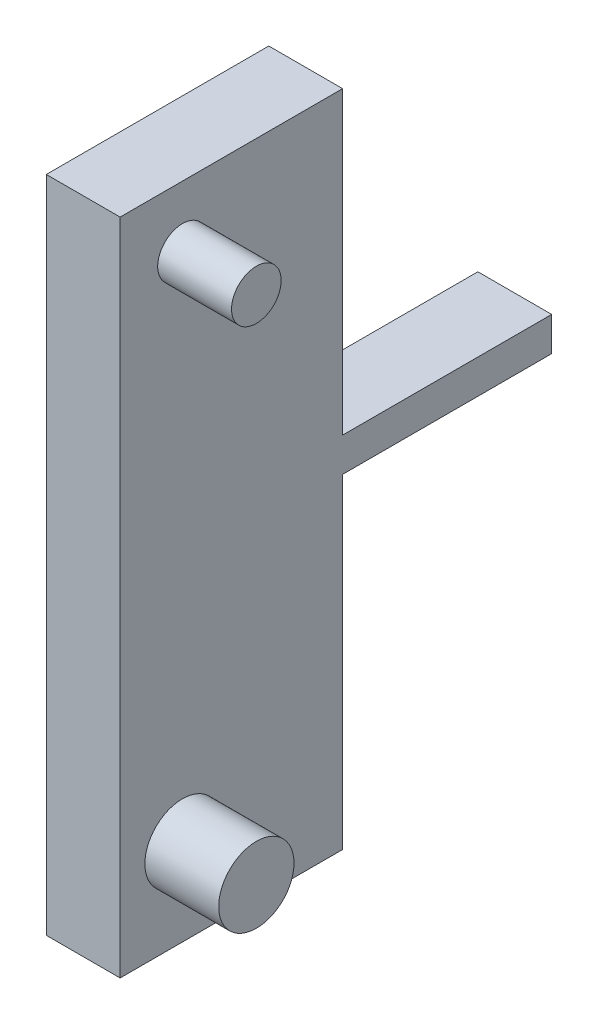
ISO-10303-21;
HEADER;
FILE_DESCRIPTION(('STEP AP214'),'2;1');
FILE_NAME('part.step','',(''),(''),'','','');
FILE_SCHEMA(('AUTOMOTIVE_DESIGN { 1 0 10303 214 1 1 1 1 }'));
ENDSEC;
DATA;
#1=APPLICATION_CONTEXT('core data for automotive mechanical design processes');
#2=APPLICATION_PROTOCOL_DEFINITION('international standard','automotive_design',2000,#1);
#3=PRODUCT_CONTEXT('',#1,'mechanical');
#4=PRODUCT('Part','Part','',(#3));
#5=PRODUCT_RELATED_PRODUCT_CATEGORY('part','',(#4));
#6=PRODUCT_DEFINITION_FORMATION('','',#4);
#7=PRODUCT_DEFINITION_CONTEXT('part definition',#1,'design');
#8=PRODUCT_DEFINITION('design','',#6,#7);
#9=PRODUCT_DEFINITION_SHAPE('','',#8);
#10=(LENGTH_UNIT() NAMED_UNIT(*) SI_UNIT(.MILLI.,.METRE.));
#11=(NAMED_UNIT(*) PLANE_ANGLE_UNIT() SI_UNIT($,.RADIAN.));
#12=(NAMED_UNIT(*) SI_UNIT($,.STERADIAN.) SOLID_ANGLE_UNIT());
#13=UNCERTAINTY_MEASURE_WITH_UNIT(LENGTH_MEASURE(1.E-05),#10,'distance_accuracy_value','');
#14=(GEOMETRIC_REPRESENTATION_CONTEXT(3) GLOBAL_UNCERTAINTY_ASSIGNED_CONTEXT((#13)) GLOBAL_UNIT_ASSIGNED_CONTEXT((#10,
#11,#12)) REPRESENTATION_CONTEXT('',''));
#15=CARTESIAN_POINT('',(0.,0.,0.));
#16=DIRECTION('',(0.,0.,1.));
#17=DIRECTION('',(1.,0.,0.));
#18=AXIS2_PLACEMENT_3D('',#15,#16,#17);
#19=CARTESIAN_POINT('',(10.,-40.9543032918619,44.2382323851614));
#20=DIRECTION('',(-1.,0.,0.));
#21=DIRECTION('',(0.,0.,1.));
#22=AXIS2_PLACEMENT_3D('',#19,#20,#21);
#23=CYLINDRICAL_SURFACE('',#22,1.68);
#24=CARTESIAN_POINT('',(5.,-40.9543032918619,44.2382323851614));
#25=DIRECTION('',(1.,0.,0.));
#26=DIRECTION('',(0.,0.,-1.));
#27=AXIS2_PLACEMENT_3D('',#24,#25,#26);
#28=CIRCLE('',#27,1.68);
#29=CARTESIAN_POINT('',(5.,-40.9543032918619,42.5582323851614));
#30=VERTEX_POINT('',#29);
#31=EDGE_CURVE('E48',#30,#30,#28,.T.);
#32=ORIENTED_EDGE('',*,*,#31,.T.);
#33=EDGE_LOOP('',(#32));
#34=FACE_BOUND('',#33,.T.);
#35=CARTESIAN_POINT('',(10.,-40.9543032918619,44.2382323851614));
#36=DIRECTION('',(1.,0.,0.));
#37=DIRECTION('',(0.,0.,-1.));
#38=AXIS2_PLACEMENT_3D('',#35,#36,#37);
#39=CIRCLE('',#38,1.68);
#40=CARTESIAN_POINT('',(10.,-40.9543032918619,42.5582323851614));
#41=VERTEX_POINT('',#40);
#42=EDGE_CURVE('E11',#41,#41,#39,.T.);
#43=ORIENTED_EDGE('',*,*,#42,.F.);
#44=EDGE_LOOP('',(#43));
#45=FACE_BOUND('',#44,.T.);
#46=ADVANCED_FACE('F44',(#34,#45),#23,.T.);
#47=CARTESIAN_POINT('',(10.,-40.9543032918619,44.2382323851614));
#48=DIRECTION('',(1.,0.,0.));
#49=DIRECTION('',(0.,0.,-1.));
#50=AXIS2_PLACEMENT_3D('',#47,#48,#49);
#51=PLANE('',#50);
#52=ORIENTED_EDGE('',*,*,#42,.T.);
#53=EDGE_LOOP('',(#52));
#54=FACE_BOUND('',#53,.T.);
#55=ADVANCED_FACE('F215',(#54),#51,.T.);
#56=CARTESIAN_POINT('',(5.,-57.1024019508511,0.));
#57=DIRECTION('',(0.,1.,0.));
#58=DIRECTION('',(0.,0.,1.));
#59=AXIS2_PLACEMENT_3D('',#56,#57,#58);
#60=PLANE('',#59);
#61=DIRECTION('',(0.,0.,-1.));
#62=VECTOR('',#61,1.);
#63=CARTESIAN_POINT('',(0.,-57.1024019508511,0.));
#64=LINE('',#63,#62);
#65=CARTESIAN_POINT('',(0.,-57.1024019508511,33.3968296630289));
#66=VERTEX_POINT('',#65);
#67=CARTESIAN_POINT('',(0.,-57.1024019508511,19.2382323851614));
#68=VERTEX_POINT('',#67);
#69=EDGE_CURVE('E149',#66,#68,#64,.T.);
#70=ORIENTED_EDGE('',*,*,#69,.F.);
#71=DIRECTION('',(-1.,0.,0.));
#72=VECTOR('',#71,1.);
#73=CARTESIAN_POINT('',(5.,-57.1024019508511,33.3968296630289));
#74=LINE('',#73,#72);
#75=CARTESIAN_POINT('',(5.,-57.1024019508511,33.3968296630289));
#76=VERTEX_POINT('',#75);
#77=EDGE_CURVE('E104',#76,#66,#74,.T.);
#78=ORIENTED_EDGE('',*,*,#77,.F.);
#79=DIRECTION('',(0.,0.,-1.));
#80=VECTOR('',#79,1.);
#81=CARTESIAN_POINT('',(5.,-57.1024019508511,0.));
#82=LINE('',#81,#80);
#83=CARTESIAN_POINT('',(5.,-57.1024019508511,19.2382323851614));
#84=VERTEX_POINT('',#83);
#85=EDGE_CURVE('E171',#76,#84,#82,.T.);
#86=ORIENTED_EDGE('',*,*,#85,.T.);
#87=DIRECTION('',(-1.,0.,0.));
#88=VECTOR('',#87,1.);
#89=CARTESIAN_POINT('',(5.,-57.1024019508511,19.2382323851614));
#90=LINE('',#89,#88);
#91=EDGE_CURVE('E97',#84,#68,#90,.T.);
#92=ORIENTED_EDGE('',*,*,#91,.T.);
#93=EDGE_LOOP('',(#70,#78,#86,#92));
#94=FACE_BOUND('',#93,.T.);
#95=ADVANCED_FACE('F219',(#94),#60,.T.);
#96=CARTESIAN_POINT('',(5.,0.,33.3968296630289));
#97=DIRECTION('',(0.,0.,1.));
#98=DIRECTION('',(1.,0.,0.));
#99=AXIS2_PLACEMENT_3D('',#96,#97,#98);
#100=PLANE('',#99);
#101=DIRECTION('',(0.,1.,0.));
#102=VECTOR('',#101,1.);
#103=CARTESIAN_POINT('',(0.,0.,33.3968296630289));
#104=LINE('',#103,#102);
#105=CARTESIAN_POINT('',(0.,-36.7831730724219,33.3968296630289));
#106=VERTEX_POINT('',#105);
#107=EDGE_CURVE('E155',#66,#106,#104,.T.);
#108=ORIENTED_EDGE('',*,*,#107,.T.);
#109=DIRECTION('',(-1.,0.,0.));
#110=VECTOR('',#109,1.);
#111=CARTESIAN_POINT('',(5.,-36.7831730724219,33.3968296630289));
#112=LINE('',#111,#110);
#113=CARTESIAN_POINT('',(5.,-36.7831730724219,33.3968296630289));
#114=VERTEX_POINT('',#113);
#115=EDGE_CURVE('E186',#114,#106,#112,.T.);
#116=ORIENTED_EDGE('',*,*,#115,.F.);
#117=DIRECTION('',(0.,1.,0.));
#118=VECTOR('',#117,1.);
#119=CARTESIAN_POINT('',(5.,0.,33.3968296630289));
#120=LINE('',#119,#118);
#121=EDGE_CURVE('E131',#76,#114,#120,.T.);
#122=ORIENTED_EDGE('',*,*,#121,.F.);
#123=ORIENTED_EDGE('',*,*,#77,.T.);
#124=EDGE_LOOP('',(#108,#116,#122,#123));
#125=FACE_BOUND('',#124,.T.);
#126=ADVANCED_FACE('F222',(#125),#100,.F.);
#127=CARTESIAN_POINT('',(5.,-36.7831730724219,0.));
#128=DIRECTION('',(0.,1.,0.));
#129=DIRECTION('',(0.,0.,1.));
#130=AXIS2_PLACEMENT_3D('',#127,#128,#129);
#131=PLANE('',#130);
#132=DIRECTION('',(0.,0.,-1.));
#133=VECTOR('',#132,1.);
#134=CARTESIAN_POINT('',(0.,-36.7831730724219,0.));
#135=LINE('',#134,#133);
#136=CARTESIAN_POINT('',(0.,-36.7831730724219,48.461100861198));
#137=VERTEX_POINT('',#136);
#138=EDGE_CURVE('E160',#137,#106,#135,.T.);
#139=ORIENTED_EDGE('',*,*,#138,.F.);
#140=DIRECTION('',(-1.,0.,0.));
#141=VECTOR('',#140,1.);
#142=CARTESIAN_POINT('',(5.,-36.7831730724219,48.461100861198));
#143=LINE('',#142,#141);
#144=CARTESIAN_POINT('',(5.,-36.7831730724219,48.461100861198));
#145=VERTEX_POINT('',#144);
#146=EDGE_CURVE('E183',#145,#137,#143,.T.);
#147=ORIENTED_EDGE('',*,*,#146,.F.);
#148=DIRECTION('',(0.,0.,-1.));
#149=VECTOR('',#148,1.);
#150=CARTESIAN_POINT('',(5.,-36.7831730724219,0.));
#151=LINE('',#150,#149);
#152=EDGE_CURVE('E333',#145,#114,#151,.T.);
#153=ORIENTED_EDGE('',*,*,#152,.T.);
#154=ORIENTED_EDGE('',*,*,#115,.T.);
#155=EDGE_LOOP('',(#139,#147,#153,#154));
#156=FACE_BOUND('',#155,.T.);
#157=ADVANCED_FACE('F230',(#156),#131,.T.);
#158=CARTESIAN_POINT('',(5.,0.,48.461100861198));
#159=DIRECTION('',(0.,0.,1.));
#160=DIRECTION('',(1.,0.,0.));
#161=AXIS2_PLACEMENT_3D('',#158,#159,#160);
#162=PLANE('',#161);
#163=DIRECTION('',(0.,1.,0.));
#164=VECTOR('',#163,1.);
#165=CARTESIAN_POINT('',(0.,0.,48.461100861198));
#166=LINE('',#165,#164);
#167=CARTESIAN_POINT('',(0.,-81.4075236028473,48.461100861198));
#168=VERTEX_POINT('',#167);
#169=EDGE_CURVE('E163',#168,#137,#166,.T.);
#170=ORIENTED_EDGE('',*,*,#169,.F.);
#171=DIRECTION('',(-1.,0.,0.));
#172=VECTOR('',#171,1.);
#173=CARTESIAN_POINT('',(5.,-81.4075236028473,48.461100861198));
#174=LINE('',#173,#172);
#175=CARTESIAN_POINT('',(5.,-81.4075236028473,48.461100861198));
#176=VERTEX_POINT('',#175);
#177=EDGE_CURVE('E179',#176,#168,#174,.T.);
#178=ORIENTED_EDGE('',*,*,#177,.F.);
#179=DIRECTION('',(0.,1.,0.));
#180=VECTOR('',#179,1.);
#181=CARTESIAN_POINT('',(5.,0.,48.461100861198));
#182=LINE('',#181,#180);
#183=EDGE_CURVE('E332',#176,#145,#182,.T.);
#184=ORIENTED_EDGE('',*,*,#183,.T.);
#185=ORIENTED_EDGE('',*,*,#146,.T.);
#186=EDGE_LOOP('',(#170,#178,#184,#185));
#187=FACE_BOUND('',#186,.T.);
#188=ADVANCED_FACE('F229',(#187),#162,.T.);
#189=CARTESIAN_POINT('',(5.,-81.4075236028473,0.));
#190=DIRECTION('',(0.,1.,0.));
#191=DIRECTION('',(0.,0.,1.));
#192=AXIS2_PLACEMENT_3D('',#189,#190,#191);
#193=PLANE('',#192);
#194=DIRECTION('',(0.,0.,-1.));
#195=VECTOR('',#194,1.);
#196=CARTESIAN_POINT('',(0.,-81.4075236028473,0.));
#197=LINE('',#196,#195);
#198=CARTESIAN_POINT('',(0.,-81.4075236028473,33.3968296630289));
#199=VERTEX_POINT('',#198);
#200=EDGE_CURVE('E164',#168,#199,#197,.T.);
#201=ORIENTED_EDGE('',*,*,#200,.T.);
#202=DIRECTION('',(-1.,0.,0.));
#203=VECTOR('',#202,1.);
#204=CARTESIAN_POINT('',(5.,-81.4075236028473,33.3968296630289));
#205=LINE('',#204,#203);
#206=CARTESIAN_POINT('',(5.,-81.4075236028473,33.3968296630289));
#207=VERTEX_POINT('',#206);
#208=EDGE_CURVE('E140',#207,#199,#205,.T.);
#209=ORIENTED_EDGE('',*,*,#208,.F.);
#210=DIRECTION('',(0.,0.,-1.));
#211=VECTOR('',#210,1.);
#212=CARTESIAN_POINT('',(5.,-81.4075236028473,0.));
#213=LINE('',#212,#211);
#214=EDGE_CURVE('E124',#176,#207,#213,.T.);
#215=ORIENTED_EDGE('',*,*,#214,.F.);
#216=ORIENTED_EDGE('',*,*,#177,.T.);
#217=EDGE_LOOP('',(#201,#209,#215,#216));
#218=FACE_BOUND('',#217,.T.);
#219=ADVANCED_FACE('F233',(#218),#193,.F.);
#220=CARTESIAN_POINT('',(0.,-59.4062046328728,33.3968296630289));
#221=VERTEX_POINT('',#220);
#222=EDGE_CURVE('E134',#199,#221,#104,.T.);
#223=ORIENTED_EDGE('',*,*,#222,.T.);
#224=DIRECTION('',(-1.,0.,0.));
#225=VECTOR('',#224,1.);
#226=CARTESIAN_POINT('',(5.,-59.4062046328728,33.3968296630289));
#227=LINE('',#226,#225);
#228=CARTESIAN_POINT('',(5.,-59.4062046328728,33.3968296630289));
#229=VERTEX_POINT('',#228);
#230=EDGE_CURVE('E135',#229,#221,#227,.T.);
#231=ORIENTED_EDGE('',*,*,#230,.F.);
#232=EDGE_CURVE('E116',#207,#229,#120,.T.);
#233=ORIENTED_EDGE('',*,*,#232,.F.);
#234=ORIENTED_EDGE('',*,*,#208,.T.);
#235=EDGE_LOOP('',(#223,#231,#233,#234));
#236=FACE_BOUND('',#235,.T.);
#237=ADVANCED_FACE('F133',(#236),#100,.F.);
#238=CARTESIAN_POINT('',(5.,-59.4062046328727,0.));
#239=DIRECTION('',(0.,1.,0.));
#240=DIRECTION('',(0.,0.,1.));
#241=AXIS2_PLACEMENT_3D('',#238,#239,#240);
#242=PLANE('',#241);
#243=DIRECTION('',(0.,0.,-1.));
#244=VECTOR('',#243,1.);
#245=CARTESIAN_POINT('',(0.,-59.4062046328727,0.));
#246=LINE('',#245,#244);
#247=CARTESIAN_POINT('',(0.,-59.4062046328728,19.2382323851614));
#248=VERTEX_POINT('',#247);
#249=EDGE_CURVE('E91',#221,#248,#246,.T.);
#250=ORIENTED_EDGE('',*,*,#249,.T.);
#251=DIRECTION('',(-1.,0.,0.));
#252=VECTOR('',#251,1.);
#253=CARTESIAN_POINT('',(5.,-59.4062046328728,19.2382323851614));
#254=LINE('',#253,#252);
#255=CARTESIAN_POINT('',(5.,-59.4062046328728,19.2382323851614));
#256=VERTEX_POINT('',#255);
#257=EDGE_CURVE('E138',#256,#248,#254,.T.);
#258=ORIENTED_EDGE('',*,*,#257,.F.);
#259=DIRECTION('',(0.,0.,-1.));
#260=VECTOR('',#259,1.);
#261=CARTESIAN_POINT('',(5.,-59.4062046328727,0.));
#262=LINE('',#261,#260);
#263=EDGE_CURVE('E122',#229,#256,#262,.T.);
#264=ORIENTED_EDGE('',*,*,#263,.F.);
#265=ORIENTED_EDGE('',*,*,#230,.T.);
#266=EDGE_LOOP('',(#250,#258,#264,#265));
#267=FACE_BOUND('',#266,.T.);
#268=ADVANCED_FACE('F139',(#267),#242,.F.);
#269=CARTESIAN_POINT('',(5.,0.,19.2382323851614));
#270=DIRECTION('',(0.,0.,1.));
#271=DIRECTION('',(1.,0.,0.));
#272=AXIS2_PLACEMENT_3D('',#269,#270,#271);
#273=PLANE('',#272);
#274=DIRECTION('',(0.,1.,0.));
#275=VECTOR('',#274,1.);
#276=CARTESIAN_POINT('',(0.,0.,19.2382323851614));
#277=LINE('',#276,#275);
#278=EDGE_CURVE('E169',#248,#68,#277,.T.);
#279=ORIENTED_EDGE('',*,*,#278,.T.);
#280=ORIENTED_EDGE('',*,*,#91,.F.);
#281=DIRECTION('',(0.,1.,0.));
#282=VECTOR('',#281,1.);
#283=CARTESIAN_POINT('',(5.,0.,19.2382323851614));
#284=LINE('',#283,#282);
#285=EDGE_CURVE('E65',#256,#84,#284,.T.);
#286=ORIENTED_EDGE('',*,*,#285,.F.);
#287=ORIENTED_EDGE('',*,*,#257,.T.);
#288=EDGE_LOOP('',(#279,#280,#286,#287));
#289=FACE_BOUND('',#288,.T.);
#290=ADVANCED_FACE('F199',(#289),#273,.F.);
#291=CARTESIAN_POINT('',(5.,0.,0.));
#292=DIRECTION('',(1.,0.,0.));
#293=DIRECTION('',(0.,0.,-1.));
#294=AXIS2_PLACEMENT_3D('',#291,#292,#293);
#295=PLANE('',#294);
#296=CARTESIAN_POINT('',(5.,-75.5543032918619,44.2382323851614));
#297=DIRECTION('',(1.,0.,0.));
#298=DIRECTION('',(0.,0.,-1.));
#299=AXIS2_PLACEMENT_3D('',#296,#297,#298);
#300=CIRCLE('',#299,2.54999999999999);
#301=CARTESIAN_POINT('',(5.,-75.5543032918619,41.6882323851615));
#302=VERTEX_POINT('',#301);
#303=EDGE_CURVE('E151',#302,#302,#300,.F.);
#304=ORIENTED_EDGE('',*,*,#303,.T.);
#305=EDGE_LOOP('',(#304));
#306=FACE_BOUND('',#305,.T.);
#307=ORIENTED_EDGE('',*,*,#31,.F.);
#308=EDGE_LOOP('',(#307));
#309=FACE_BOUND('',#308,.T.);
#310=ORIENTED_EDGE('',*,*,#85,.F.);
#311=ORIENTED_EDGE('',*,*,#121,.T.);
#312=ORIENTED_EDGE('',*,*,#152,.F.);
#313=ORIENTED_EDGE('',*,*,#183,.F.);
#314=ORIENTED_EDGE('',*,*,#214,.T.);
#315=ORIENTED_EDGE('',*,*,#232,.T.);
#316=ORIENTED_EDGE('',*,*,#263,.T.);
#317=ORIENTED_EDGE('',*,*,#285,.T.);
#318=EDGE_LOOP('',(#310,#311,#312,#313,#314,#315,#316,#317));
#319=FACE_BOUND('',#318,.T.);
#320=ADVANCED_FACE('F119',(#306,#309,#319),#295,.T.);
#321=CARTESIAN_POINT('',(0.,-40.9543032918619,44.2382323851614));
#322=DIRECTION('',(1.,0.,0.));
#323=DIRECTION('',(0.,0.,-1.));
#324=AXIS2_PLACEMENT_3D('',#321,#322,#323);
#325=PLANE('',#324);
#326=ORIENTED_EDGE('',*,*,#69,.T.);
#327=ORIENTED_EDGE('',*,*,#278,.F.);
#328=ORIENTED_EDGE('',*,*,#249,.F.);
#329=ORIENTED_EDGE('',*,*,#222,.F.);
#330=ORIENTED_EDGE('',*,*,#200,.F.);
#331=ORIENTED_EDGE('',*,*,#169,.T.);
#332=ORIENTED_EDGE('',*,*,#138,.T.);
#333=ORIENTED_EDGE('',*,*,#107,.F.);
#334=EDGE_LOOP('',(#326,#327,#328,#329,#330,#331,#332,#333));
#335=FACE_BOUND('',#334,.T.);
#336=ADVANCED_FACE('F197',(#335),#325,.F.);
#337=CARTESIAN_POINT('',(10.,-75.5543032918619,44.2382323851614));
#338=DIRECTION('',(-1.,0.,0.));
#339=DIRECTION('',(0.,0.,1.));
#340=AXIS2_PLACEMENT_3D('',#337,#338,#339);
#341=CYLINDRICAL_SURFACE('',#340,2.54999999999999);
#342=ORIENTED_EDGE('',*,*,#303,.F.);
#343=EDGE_LOOP('',(#342));
#344=FACE_BOUND('',#343,.T.);
#345=CARTESIAN_POINT('',(10.,-75.5543032918619,44.2382323851614));
#346=DIRECTION('',(1.,0.,0.));
#347=DIRECTION('',(0.,0.,-1.));
#348=AXIS2_PLACEMENT_3D('',#345,#346,#347);
#349=CIRCLE('',#348,2.54999999999999);
#350=CARTESIAN_POINT('',(10.,-75.5543032918619,41.6882323851615));
#351=VERTEX_POINT('',#350);
#352=EDGE_CURVE('E341',#351,#351,#349,.T.);
#353=ORIENTED_EDGE('',*,*,#352,.F.);
#354=EDGE_LOOP('',(#353));
#355=FACE_BOUND('',#354,.T.);
#356=ADVANCED_FACE('F210',(#344,#355),#341,.T.);
#357=CARTESIAN_POINT('',(10.,-75.5543032918619,44.2382323851614));
#358=DIRECTION('',(1.,0.,0.));
#359=DIRECTION('',(0.,0.,-1.));
#360=AXIS2_PLACEMENT_3D('',#357,#358,#359);
#361=PLANE('',#360);
#362=ORIENTED_EDGE('',*,*,#352,.T.);
#363=EDGE_LOOP('',(#362));
#364=FACE_BOUND('',#363,.T.);
#365=ADVANCED_FACE('F277',(#364),#361,.T.);
#366=CLOSED_SHELL('',(#46,#55,#95,#126,#157,#188,#219,#237,#268,#290,#320,#336,#356,#365));
#367=MANIFOLD_SOLID_BREP('B2',#366);
#368=ADVANCED_BREP_SHAPE_REPRESENTATION('',(#18,#367),#14);
#369=SHAPE_DEFINITION_REPRESENTATION(#9,#368);
ENDSEC;
END-ISO-10303-21;
